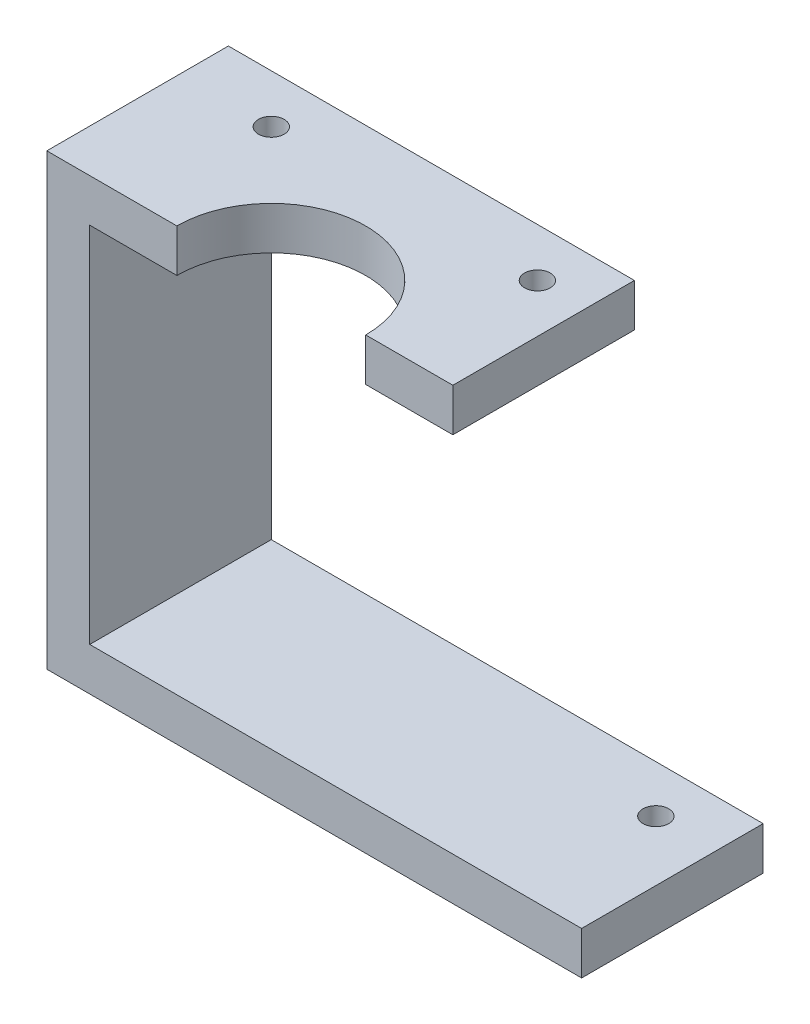
ISO-10303-21;
HEADER;
FILE_DESCRIPTION(('STEP AP214'),'2;1');
FILE_NAME('part.step','',(''),(''),'','','');
FILE_SCHEMA(('AUTOMOTIVE_DESIGN { 1 0 10303 214 1 1 1 1 }'));
ENDSEC;
DATA;
#1=APPLICATION_CONTEXT('core data for automotive mechanical design processes');
#2=APPLICATION_PROTOCOL_DEFINITION('international standard','automotive_design',2000,#1);
#3=PRODUCT_CONTEXT('',#1,'mechanical');
#4=PRODUCT('Part','Part','',(#3));
#5=PRODUCT_RELATED_PRODUCT_CATEGORY('part','',(#4));
#6=PRODUCT_DEFINITION_FORMATION('','',#4);
#7=PRODUCT_DEFINITION_CONTEXT('part definition',#1,'design');
#8=PRODUCT_DEFINITION('design','',#6,#7);
#9=PRODUCT_DEFINITION_SHAPE('','',#8);
#10=(LENGTH_UNIT() NAMED_UNIT(*) SI_UNIT(.MILLI.,.METRE.));
#11=(NAMED_UNIT(*) PLANE_ANGLE_UNIT() SI_UNIT($,.RADIAN.));
#12=(NAMED_UNIT(*) SI_UNIT($,.STERADIAN.) SOLID_ANGLE_UNIT());
#13=UNCERTAINTY_MEASURE_WITH_UNIT(LENGTH_MEASURE(1.E-05),#10,'distance_accuracy_value','');
#14=(GEOMETRIC_REPRESENTATION_CONTEXT(3) GLOBAL_UNCERTAINTY_ASSIGNED_CONTEXT((#13)) GLOBAL_UNIT_ASSIGNED_CONTEXT((#10,
#11,#12)) REPRESENTATION_CONTEXT('',''));
#15=CARTESIAN_POINT('',(0.,0.,0.));
#16=DIRECTION('',(0.,0.,1.));
#17=DIRECTION('',(1.,0.,0.));
#18=AXIS2_PLACEMENT_3D('',#15,#16,#17);
#19=CARTESIAN_POINT('',(0.,5.,0.));
#20=DIRECTION('',(0.,-1.,0.));
#21=DIRECTION('',(0.,0.,-1.));
#22=AXIS2_PLACEMENT_3D('',#19,#20,#21);
#23=PLANE('',#22);
#24=CARTESIAN_POINT('',(55.3,5.,-36.8));
#25=DIRECTION('',(0.,1.,0.));
#26=DIRECTION('',(0.,0.,1.));
#27=AXIS2_PLACEMENT_3D('',#24,#25,#26);
#28=CIRCLE('',#27,1.5);
#29=CARTESIAN_POINT('',(55.3,5.,-35.3));
#30=VERTEX_POINT('',#29);
#31=EDGE_CURVE('E263',#30,#30,#28,.T.);
#32=ORIENTED_EDGE('',*,*,#31,.F.);
#33=EDGE_LOOP('',(#32));
#34=FACE_BOUND('',#33,.T.);
#35=DIRECTION('',(0.,0.,-1.));
#36=VECTOR('',#35,1.);
#37=CARTESIAN_POINT('',(5.,5.,-42.3));
#38=LINE('',#37,#36);
#39=CARTESIAN_POINT('',(5.,5.,-21.15));
#40=VERTEX_POINT('',#39);
#41=CARTESIAN_POINT('',(5.,5.,-42.3));
#42=VERTEX_POINT('',#41);
#43=EDGE_CURVE('E180',#40,#42,#38,.T.);
#44=ORIENTED_EDGE('',*,*,#43,.F.);
#45=DIRECTION('',(1.,0.,0.));
#46=VECTOR('',#45,1.);
#47=CARTESIAN_POINT('',(0.,5.,-21.15));
#48=LINE('',#47,#46);
#49=CARTESIAN_POINT('',(62.3,5.,-21.15));
#50=VERTEX_POINT('',#49);
#51=EDGE_CURVE('E249',#40,#50,#48,.T.);
#52=ORIENTED_EDGE('',*,*,#51,.T.);
#53=DIRECTION('',(0.,0.,-1.));
#54=VECTOR('',#53,1.);
#55=CARTESIAN_POINT('',(62.3,5.,0.));
#56=LINE('',#55,#54);
#57=CARTESIAN_POINT('',(62.3,5.,-42.3));
#58=VERTEX_POINT('',#57);
#59=EDGE_CURVE('E191',#50,#58,#56,.T.);
#60=ORIENTED_EDGE('',*,*,#59,.T.);
#61=DIRECTION('',(-1.,0.,0.));
#62=VECTOR('',#61,1.);
#63=CARTESIAN_POINT('',(0.,5.,-42.3));
#64=LINE('',#63,#62);
#65=EDGE_CURVE('E194',#58,#42,#64,.T.);
#66=ORIENTED_EDGE('',*,*,#65,.T.);
#67=EDGE_LOOP('',(#44,#52,#60,#66));
#68=FACE_BOUND('',#67,.T.);
#69=ADVANCED_FACE('F53',(#34,#68),#23,.F.);
#70=CARTESIAN_POINT('',(0.,5.,0.));
#71=DIRECTION('',(1.,0.,0.));
#72=DIRECTION('',(0.,0.,-1.));
#73=AXIS2_PLACEMENT_3D('',#70,#71,#72);
#74=PLANE('',#73);
#75=DIRECTION('',(0.,0.,1.));
#76=VECTOR('',#75,1.);
#77=CARTESIAN_POINT('',(0.,0.,0.));
#78=LINE('',#77,#76);
#79=CARTESIAN_POINT('',(0.,0.,-42.3));
#80=VERTEX_POINT('',#79);
#81=CARTESIAN_POINT('',(0.,0.,-21.15));
#82=VERTEX_POINT('',#81);
#83=EDGE_CURVE('E190',#80,#82,#78,.T.);
#84=ORIENTED_EDGE('',*,*,#83,.T.);
#85=DIRECTION('',(0.,1.,0.));
#86=VECTOR('',#85,1.);
#87=CARTESIAN_POINT('',(0.,5.,-21.15));
#88=LINE('',#87,#86);
#89=CARTESIAN_POINT('',(0.,52.3,-21.15));
#90=VERTEX_POINT('',#89);
#91=EDGE_CURVE('E228',#82,#90,#88,.T.);
#92=ORIENTED_EDGE('',*,*,#91,.T.);
#93=DIRECTION('',(0.,0.,1.));
#94=VECTOR('',#93,1.);
#95=CARTESIAN_POINT('',(0.,52.3,-42.3));
#96=LINE('',#95,#94);
#97=CARTESIAN_POINT('',(0.,52.3,-42.3));
#98=VERTEX_POINT('',#97);
#99=EDGE_CURVE('E144',#98,#90,#96,.T.);
#100=ORIENTED_EDGE('',*,*,#99,.F.);
#101=DIRECTION('',(0.,-1.,0.));
#102=VECTOR('',#101,1.);
#103=CARTESIAN_POINT('',(0.,5.,-42.3));
#104=LINE('',#103,#102);
#105=EDGE_CURVE('E199',#98,#80,#104,.T.);
#106=ORIENTED_EDGE('',*,*,#105,.T.);
#107=EDGE_LOOP('',(#84,#92,#100,#106));
#108=FACE_BOUND('',#107,.T.);
#109=ADVANCED_FACE('F55',(#108),#74,.F.);
#110=CARTESIAN_POINT('',(62.3,5.,0.));
#111=DIRECTION('',(-1.,0.,0.));
#112=DIRECTION('',(0.,0.,1.));
#113=AXIS2_PLACEMENT_3D('',#110,#111,#112);
#114=PLANE('',#113);
#115=ORIENTED_EDGE('',*,*,#59,.F.);
#116=DIRECTION('',(0.,-1.,0.));
#117=VECTOR('',#116,1.);
#118=CARTESIAN_POINT('',(62.3,5.,-21.15));
#119=LINE('',#118,#117);
#120=CARTESIAN_POINT('',(62.3,0.,-21.15));
#121=VERTEX_POINT('',#120);
#122=EDGE_CURVE('E252',#50,#121,#119,.T.);
#123=ORIENTED_EDGE('',*,*,#122,.T.);
#124=DIRECTION('',(0.,0.,-1.));
#125=VECTOR('',#124,1.);
#126=CARTESIAN_POINT('',(62.3,0.,0.));
#127=LINE('',#126,#125);
#128=CARTESIAN_POINT('',(62.3,0.,-42.3));
#129=VERTEX_POINT('',#128);
#130=EDGE_CURVE('E203',#121,#129,#127,.T.);
#131=ORIENTED_EDGE('',*,*,#130,.T.);
#132=DIRECTION('',(0.,-1.,0.));
#133=VECTOR('',#132,1.);
#134=CARTESIAN_POINT('',(62.3,5.,-42.3));
#135=LINE('',#134,#133);
#136=EDGE_CURVE('E136',#58,#129,#135,.T.);
#137=ORIENTED_EDGE('',*,*,#136,.F.);
#138=EDGE_LOOP('',(#115,#123,#131,#137));
#139=FACE_BOUND('',#138,.T.);
#140=ADVANCED_FACE('F251',(#139),#114,.F.);
#141=CARTESIAN_POINT('',(0.,5.,-42.3));
#142=DIRECTION('',(0.,0.,1.));
#143=DIRECTION('',(1.,0.,0.));
#144=AXIS2_PLACEMENT_3D('',#141,#142,#143);
#145=PLANE('',#144);
#146=DIRECTION('',(-1.,0.,0.));
#147=VECTOR('',#146,1.);
#148=CARTESIAN_POINT('',(0.,0.,-42.3));
#149=LINE('',#148,#147);
#150=EDGE_CURVE('E195',#129,#80,#149,.T.);
#151=ORIENTED_EDGE('',*,*,#150,.T.);
#152=ORIENTED_EDGE('',*,*,#105,.F.);
#153=DIRECTION('',(1.,0.,0.));
#154=VECTOR('',#153,1.);
#155=CARTESIAN_POINT('',(0.,52.3,-42.3));
#156=LINE('',#155,#154);
#157=CARTESIAN_POINT('',(47.3,52.3,-42.3));
#158=VERTEX_POINT('',#157);
#159=EDGE_CURVE('E168',#98,#158,#156,.T.);
#160=ORIENTED_EDGE('',*,*,#159,.T.);
#161=DIRECTION('',(0.,-1.,0.));
#162=VECTOR('',#161,1.);
#163=CARTESIAN_POINT('',(47.3,52.3,-42.3));
#164=LINE('',#163,#162);
#165=CARTESIAN_POINT('',(47.3,47.3,-42.3));
#166=VERTEX_POINT('',#165);
#167=EDGE_CURVE('E173',#158,#166,#164,.T.);
#168=ORIENTED_EDGE('',*,*,#167,.T.);
#169=DIRECTION('',(1.,0.,0.));
#170=VECTOR('',#169,1.);
#171=CARTESIAN_POINT('',(0.,47.3,-42.3));
#172=LINE('',#171,#170);
#173=CARTESIAN_POINT('',(5.,47.3,-42.3));
#174=VERTEX_POINT('',#173);
#175=EDGE_CURVE('E156',#174,#166,#172,.T.);
#176=ORIENTED_EDGE('',*,*,#175,.F.);
#177=DIRECTION('',(0.,-1.,0.));
#178=VECTOR('',#177,1.);
#179=CARTESIAN_POINT('',(5.,47.3,-42.3));
#180=LINE('',#179,#178);
#181=EDGE_CURVE('E184',#174,#42,#180,.T.);
#182=ORIENTED_EDGE('',*,*,#181,.T.);
#183=ORIENTED_EDGE('',*,*,#65,.F.);
#184=ORIENTED_EDGE('',*,*,#136,.T.);
#185=EDGE_LOOP('',(#151,#152,#160,#168,#176,#182,#183,#184));
#186=FACE_BOUND('',#185,.T.);
#187=ADVANCED_FACE('F217',(#186),#145,.F.);
#188=CARTESIAN_POINT('',(0.,0.,0.));
#189=DIRECTION('',(0.,-1.,0.));
#190=DIRECTION('',(0.,0.,-1.));
#191=AXIS2_PLACEMENT_3D('',#188,#189,#190);
#192=PLANE('',#191);
#193=DIRECTION('',(1.,0.,0.));
#194=VECTOR('',#193,1.);
#195=CARTESIAN_POINT('',(0.,0.,-21.15));
#196=LINE('',#195,#194);
#197=EDGE_CURVE('E226',#82,#121,#196,.T.);
#198=ORIENTED_EDGE('',*,*,#197,.F.);
#199=ORIENTED_EDGE('',*,*,#83,.F.);
#200=ORIENTED_EDGE('',*,*,#150,.F.);
#201=ORIENTED_EDGE('',*,*,#130,.F.);
#202=EDGE_LOOP('',(#198,#199,#200,#201));
#203=FACE_BOUND('',#202,.T.);
#204=CARTESIAN_POINT('',(55.3,0.,-36.8));
#205=DIRECTION('',(0.,1.,0.));
#206=DIRECTION('',(0.,0.,1.));
#207=AXIS2_PLACEMENT_3D('',#204,#205,#206);
#208=CIRCLE('',#207,1.5);
#209=CARTESIAN_POINT('',(55.3,0.,-35.3));
#210=VERTEX_POINT('',#209);
#211=EDGE_CURVE('E264',#210,#210,#208,.T.);
#212=ORIENTED_EDGE('',*,*,#211,.T.);
#213=EDGE_LOOP('',(#212));
#214=FACE_BOUND('',#213,.T.);
#215=ADVANCED_FACE('F224',(#203,#214),#192,.T.);
#216=CARTESIAN_POINT('',(5.,47.3,-42.3));
#217=DIRECTION('',(-1.,0.,0.));
#218=DIRECTION('',(0.,0.,1.));
#219=AXIS2_PLACEMENT_3D('',#216,#217,#218);
#220=PLANE('',#219);
#221=DIRECTION('',(0.,0.,-1.));
#222=VECTOR('',#221,1.);
#223=CARTESIAN_POINT('',(5.,47.3,-42.3));
#224=LINE('',#223,#222);
#225=CARTESIAN_POINT('',(5.,47.3,-21.15));
#226=VERTEX_POINT('',#225);
#227=EDGE_CURVE('E181',#226,#174,#224,.T.);
#228=ORIENTED_EDGE('',*,*,#227,.F.);
#229=DIRECTION('',(0.,-1.,0.));
#230=VECTOR('',#229,1.);
#231=CARTESIAN_POINT('',(5.,47.3,-21.15));
#232=LINE('',#231,#230);
#233=EDGE_CURVE('E146',#226,#40,#232,.T.);
#234=ORIENTED_EDGE('',*,*,#233,.T.);
#235=ORIENTED_EDGE('',*,*,#43,.T.);
#236=ORIENTED_EDGE('',*,*,#181,.F.);
#237=EDGE_LOOP('',(#228,#234,#235,#236));
#238=FACE_BOUND('',#237,.T.);
#239=ADVANCED_FACE('F244',(#238),#220,.F.);
#240=CARTESIAN_POINT('',(0.,52.3,0.));
#241=DIRECTION('',(0.,-1.,0.));
#242=DIRECTION('',(0.,0.,-1.));
#243=AXIS2_PLACEMENT_3D('',#240,#241,#242);
#244=PLANE('',#243);
#245=CARTESIAN_POINT('',(10.65,52.3,-36.65));
#246=DIRECTION('',(0.,1.,0.));
#247=DIRECTION('',(0.,0.,1.));
#248=AXIS2_PLACEMENT_3D('',#245,#246,#247);
#249=CIRCLE('',#248,1.5);
#250=CARTESIAN_POINT('',(10.65,52.3,-35.15));
#251=VERTEX_POINT('',#250);
#252=EDGE_CURVE('E268',#251,#251,#249,.T.);
#253=ORIENTED_EDGE('',*,*,#252,.F.);
#254=EDGE_LOOP('',(#253));
#255=FACE_BOUND('',#254,.T.);
#256=CARTESIAN_POINT('',(41.65,52.3,-36.65));
#257=DIRECTION('',(0.,1.,0.));
#258=DIRECTION('',(0.,0.,1.));
#259=AXIS2_PLACEMENT_3D('',#256,#257,#258);
#260=CIRCLE('',#259,1.5);
#261=CARTESIAN_POINT('',(41.65,52.3,-35.15));
#262=VERTEX_POINT('',#261);
#263=EDGE_CURVE('E161',#262,#262,#260,.T.);
#264=ORIENTED_EDGE('',*,*,#263,.F.);
#265=EDGE_LOOP('',(#264));
#266=FACE_BOUND('',#265,.T.);
#267=ORIENTED_EDGE('',*,*,#99,.T.);
#268=DIRECTION('',(1.,0.,0.));
#269=VECTOR('',#268,1.);
#270=CARTESIAN_POINT('',(0.,52.3,-21.15));
#271=LINE('',#270,#269);
#272=CARTESIAN_POINT('',(15.15,52.3,-21.15));
#273=VERTEX_POINT('',#272);
#274=EDGE_CURVE('E129',#90,#273,#271,.T.);
#275=ORIENTED_EDGE('',*,*,#274,.T.);
#276=CARTESIAN_POINT('',(26.15,52.3,-21.15));
#277=DIRECTION('',(0.,1.,0.));
#278=DIRECTION('',(0.,0.,1.));
#279=AXIS2_PLACEMENT_3D('',#276,#277,#278);
#280=CIRCLE('',#279,11.);
#281=CARTESIAN_POINT('',(37.15,52.3,-21.15));
#282=VERTEX_POINT('',#281);
#283=EDGE_CURVE('E141',#282,#273,#280,.T.);
#284=ORIENTED_EDGE('',*,*,#283,.F.);
#285=CARTESIAN_POINT('',(47.3,52.3,-21.15));
#286=VERTEX_POINT('',#285);
#287=EDGE_CURVE('E76',#282,#286,#271,.T.);
#288=ORIENTED_EDGE('',*,*,#287,.T.);
#289=DIRECTION('',(0.,0.,1.));
#290=VECTOR('',#289,1.);
#291=CARTESIAN_POINT('',(47.3,52.3,-42.3));
#292=LINE('',#291,#290);
#293=EDGE_CURVE('E164',#158,#286,#292,.T.);
#294=ORIENTED_EDGE('',*,*,#293,.F.);
#295=ORIENTED_EDGE('',*,*,#159,.F.);
#296=EDGE_LOOP('',(#267,#275,#284,#288,#294,#295));
#297=FACE_BOUND('',#296,.T.);
#298=ADVANCED_FACE('F140',(#255,#266,#297),#244,.F.);
#299=CARTESIAN_POINT('',(0.,47.3,0.));
#300=DIRECTION('',(0.,-1.,0.));
#301=DIRECTION('',(0.,0.,-1.));
#302=AXIS2_PLACEMENT_3D('',#299,#300,#301);
#303=PLANE('',#302);
#304=DIRECTION('',(1.,0.,0.));
#305=VECTOR('',#304,1.);
#306=CARTESIAN_POINT('',(0.,47.3,-21.15));
#307=LINE('',#306,#305);
#308=CARTESIAN_POINT('',(15.15,47.3,-21.15));
#309=VERTEX_POINT('',#308);
#310=EDGE_CURVE('E69',#226,#309,#307,.T.);
#311=ORIENTED_EDGE('',*,*,#310,.F.);
#312=ORIENTED_EDGE('',*,*,#227,.T.);
#313=ORIENTED_EDGE('',*,*,#175,.T.);
#314=DIRECTION('',(0.,0.,1.));
#315=VECTOR('',#314,1.);
#316=CARTESIAN_POINT('',(47.3,47.3,-42.3));
#317=LINE('',#316,#315);
#318=CARTESIAN_POINT('',(47.3,47.3,-21.15));
#319=VERTEX_POINT('',#318);
#320=EDGE_CURVE('E150',#166,#319,#317,.T.);
#321=ORIENTED_EDGE('',*,*,#320,.T.);
#322=CARTESIAN_POINT('',(37.15,47.3,-21.15));
#323=VERTEX_POINT('',#322);
#324=EDGE_CURVE('E240',#323,#319,#307,.T.);
#325=ORIENTED_EDGE('',*,*,#324,.F.);
#326=CARTESIAN_POINT('',(26.15,47.3,-21.15));
#327=DIRECTION('',(0.,1.,0.));
#328=DIRECTION('',(0.,0.,1.));
#329=AXIS2_PLACEMENT_3D('',#326,#327,#328);
#330=CIRCLE('',#329,11.);
#331=EDGE_CURVE('E151',#323,#309,#330,.T.);
#332=ORIENTED_EDGE('',*,*,#331,.T.);
#333=EDGE_LOOP('',(#311,#312,#313,#321,#325,#332));
#334=FACE_BOUND('',#333,.T.);
#335=CARTESIAN_POINT('',(10.65,47.3,-36.65));
#336=DIRECTION('',(0.,1.,0.));
#337=DIRECTION('',(0.,0.,1.));
#338=AXIS2_PLACEMENT_3D('',#335,#336,#337);
#339=CIRCLE('',#338,1.5);
#340=CARTESIAN_POINT('',(10.65,47.3,-35.15));
#341=VERTEX_POINT('',#340);
#342=EDGE_CURVE('E272',#341,#341,#339,.T.);
#343=ORIENTED_EDGE('',*,*,#342,.T.);
#344=EDGE_LOOP('',(#343));
#345=FACE_BOUND('',#344,.T.);
#346=CARTESIAN_POINT('',(41.65,47.3,-36.65));
#347=DIRECTION('',(0.,1.,0.));
#348=DIRECTION('',(0.,0.,1.));
#349=AXIS2_PLACEMENT_3D('',#346,#347,#348);
#350=CIRCLE('',#349,1.5);
#351=CARTESIAN_POINT('',(41.65,47.3,-35.15));
#352=VERTEX_POINT('',#351);
#353=EDGE_CURVE('E158',#352,#352,#350,.T.);
#354=ORIENTED_EDGE('',*,*,#353,.T.);
#355=EDGE_LOOP('',(#354));
#356=FACE_BOUND('',#355,.T.);
#357=ADVANCED_FACE('F238',(#334,#345,#356),#303,.T.);
#358=CARTESIAN_POINT('',(47.3,52.3,-42.3));
#359=DIRECTION('',(1.,0.,0.));
#360=DIRECTION('',(0.,0.,-1.));
#361=AXIS2_PLACEMENT_3D('',#358,#359,#360);
#362=PLANE('',#361);
#363=DIRECTION('',(0.,1.,0.));
#364=VECTOR('',#363,1.);
#365=CARTESIAN_POINT('',(47.3,52.3,-21.15));
#366=LINE('',#365,#364);
#367=EDGE_CURVE('E235',#319,#286,#366,.T.);
#368=ORIENTED_EDGE('',*,*,#367,.F.);
#369=ORIENTED_EDGE('',*,*,#320,.F.);
#370=ORIENTED_EDGE('',*,*,#167,.F.);
#371=ORIENTED_EDGE('',*,*,#293,.T.);
#372=EDGE_LOOP('',(#368,#369,#370,#371));
#373=FACE_BOUND('',#372,.T.);
#374=ADVANCED_FACE('F234',(#373),#362,.T.);
#375=CARTESIAN_POINT('',(26.15,52.3,-21.15));
#376=DIRECTION('',(0.,-1.,0.));
#377=DIRECTION('',(0.,0.,-1.));
#378=AXIS2_PLACEMENT_3D('',#375,#376,#377);
#379=CYLINDRICAL_SURFACE('',#378,11.);
#380=DIRECTION('',(0.,-1.,0.));
#381=VECTOR('',#380,1.);
#382=CARTESIAN_POINT('',(37.15,52.3,-21.15));
#383=LINE('',#382,#381);
#384=EDGE_CURVE('E12',#282,#323,#383,.T.);
#385=ORIENTED_EDGE('',*,*,#384,.F.);
#386=ORIENTED_EDGE('',*,*,#283,.T.);
#387=DIRECTION('',(0.,-1.,0.));
#388=VECTOR('',#387,1.);
#389=CARTESIAN_POINT('',(15.15,52.3,-21.15));
#390=LINE('',#389,#388);
#391=EDGE_CURVE('E62',#309,#273,#390,.F.);
#392=ORIENTED_EDGE('',*,*,#391,.F.);
#393=ORIENTED_EDGE('',*,*,#331,.F.);
#394=EDGE_LOOP('',(#385,#386,#392,#393));
#395=FACE_BOUND('',#394,.T.);
#396=ADVANCED_FACE('F148',(#395),#379,.F.);
#397=CARTESIAN_POINT('',(41.65,47.3,-36.65));
#398=DIRECTION('',(0.,1.,0.));
#399=DIRECTION('',(0.,0.,1.));
#400=AXIS2_PLACEMENT_3D('',#397,#398,#399);
#401=CYLINDRICAL_SURFACE('',#400,1.5);
#402=ORIENTED_EDGE('',*,*,#353,.F.);
#403=EDGE_LOOP('',(#402));
#404=FACE_BOUND('',#403,.T.);
#405=ORIENTED_EDGE('',*,*,#263,.T.);
#406=EDGE_LOOP('',(#405));
#407=FACE_BOUND('',#406,.T.);
#408=ADVANCED_FACE('F286',(#404,#407),#401,.F.);
#409=CARTESIAN_POINT('',(10.65,47.3,-36.65));
#410=DIRECTION('',(0.,1.,0.));
#411=DIRECTION('',(0.,0.,1.));
#412=AXIS2_PLACEMENT_3D('',#409,#410,#411);
#413=CYLINDRICAL_SURFACE('',#412,1.5);
#414=ORIENTED_EDGE('',*,*,#342,.F.);
#415=EDGE_LOOP('',(#414));
#416=FACE_BOUND('',#415,.T.);
#417=ORIENTED_EDGE('',*,*,#252,.T.);
#418=EDGE_LOOP('',(#417));
#419=FACE_BOUND('',#418,.T.);
#420=ADVANCED_FACE('F362',(#416,#419),#413,.F.);
#421=CARTESIAN_POINT('',(55.3,0.,-36.8));
#422=DIRECTION('',(0.,1.,0.));
#423=DIRECTION('',(0.,0.,1.));
#424=AXIS2_PLACEMENT_3D('',#421,#422,#423);
#425=CYLINDRICAL_SURFACE('',#424,1.5);
#426=ORIENTED_EDGE('',*,*,#211,.F.);
#427=EDGE_LOOP('',(#426));
#428=FACE_BOUND('',#427,.T.);
#429=ORIENTED_EDGE('',*,*,#31,.T.);
#430=EDGE_LOOP('',(#429));
#431=FACE_BOUND('',#430,.T.);
#432=ADVANCED_FACE('F370',(#428,#431),#425,.F.);
#433=CARTESIAN_POINT('',(0.,0.,-21.15));
#434=DIRECTION('',(0.,0.,-1.));
#435=DIRECTION('',(-1.,0.,0.));
#436=AXIS2_PLACEMENT_3D('',#433,#434,#435);
#437=PLANE('',#436);
#438=ORIENTED_EDGE('',*,*,#51,.F.);
#439=ORIENTED_EDGE('',*,*,#233,.F.);
#440=ORIENTED_EDGE('',*,*,#310,.T.);
#441=ORIENTED_EDGE('',*,*,#391,.T.);
#442=ORIENTED_EDGE('',*,*,#274,.F.);
#443=ORIENTED_EDGE('',*,*,#91,.F.);
#444=ORIENTED_EDGE('',*,*,#197,.T.);
#445=ORIENTED_EDGE('',*,*,#122,.F.);
#446=EDGE_LOOP('',(#438,#439,#440,#441,#442,#443,#444,#445));
#447=FACE_BOUND('',#446,.T.);
#448=ADVANCED_FACE('F128',(#447),#437,.F.);
#449=ORIENTED_EDGE('',*,*,#367,.T.);
#450=ORIENTED_EDGE('',*,*,#287,.F.);
#451=ORIENTED_EDGE('',*,*,#384,.T.);
#452=ORIENTED_EDGE('',*,*,#324,.T.);
#453=EDGE_LOOP('',(#449,#450,#451,#452));
#454=FACE_BOUND('',#453,.T.);
#455=ADVANCED_FACE('F383',(#454),#437,.F.);
#456=CLOSED_SHELL('',(#69,#109,#140,#187,#215,#239,#298,#357,#374,#396,#408,#420,#432,#448,#455));
#457=MANIFOLD_SOLID_BREP('B2',#456);
#458=ADVANCED_BREP_SHAPE_REPRESENTATION('',(#18,#457),#14);
#459=SHAPE_DEFINITION_REPRESENTATION(#9,#458);
ENDSEC;
END-ISO-10303-21;
